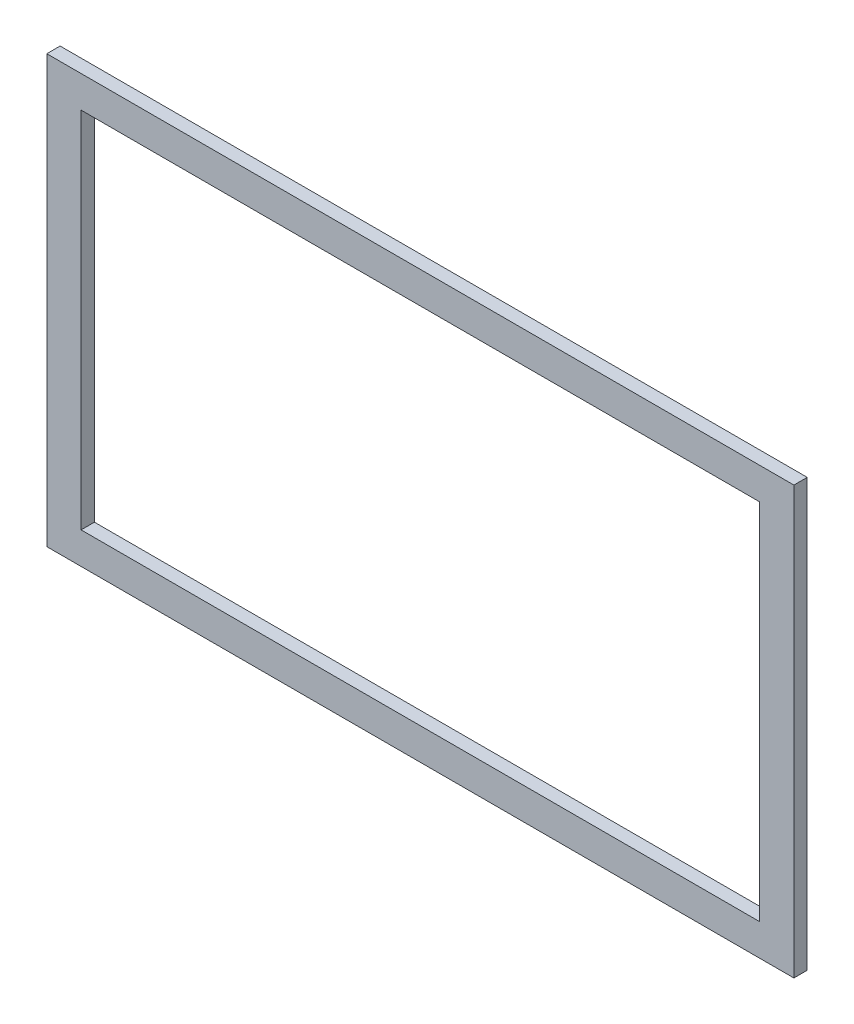
ISO-10303-21;
HEADER;
FILE_DESCRIPTION(('STEP AP214'),'2;1');
FILE_NAME('part.step','',(''),(''),'','','');
FILE_SCHEMA(('AUTOMOTIVE_DESIGN { 1 0 10303 214 1 1 1 1 }'));
ENDSEC;
DATA;
#1=APPLICATION_CONTEXT('core data for automotive mechanical design processes');
#2=APPLICATION_PROTOCOL_DEFINITION('international standard','automotive_design',2000,#1);
#3=PRODUCT_CONTEXT('',#1,'mechanical');
#4=PRODUCT('Part','Part','',(#3));
#5=PRODUCT_RELATED_PRODUCT_CATEGORY('part','',(#4));
#6=PRODUCT_DEFINITION_FORMATION('','',#4);
#7=PRODUCT_DEFINITION_CONTEXT('part definition',#1,'design');
#8=PRODUCT_DEFINITION('design','',#6,#7);
#9=PRODUCT_DEFINITION_SHAPE('','',#8);
#10=(LENGTH_UNIT() NAMED_UNIT(*) SI_UNIT(.MILLI.,.METRE.));
#11=(NAMED_UNIT(*) PLANE_ANGLE_UNIT() SI_UNIT($,.RADIAN.));
#12=(NAMED_UNIT(*) SI_UNIT($,.STERADIAN.) SOLID_ANGLE_UNIT());
#13=UNCERTAINTY_MEASURE_WITH_UNIT(LENGTH_MEASURE(1.E-05),#10,'distance_accuracy_value','');
#14=(GEOMETRIC_REPRESENTATION_CONTEXT(3) GLOBAL_UNCERTAINTY_ASSIGNED_CONTEXT((#13)) GLOBAL_UNIT_ASSIGNED_CONTEXT((#10,
#11,#12)) REPRESENTATION_CONTEXT('',''));
#15=CARTESIAN_POINT('',(0.,0.,0.));
#16=DIRECTION('',(0.,0.,1.));
#17=DIRECTION('',(1.,0.,0.));
#18=AXIS2_PLACEMENT_3D('',#15,#16,#17);
#19=CARTESIAN_POINT('',(-14.,-8.,0.5));
#20=DIRECTION('',(-1.,0.,0.));
#21=DIRECTION('',(0.,0.,1.));
#22=AXIS2_PLACEMENT_3D('',#19,#20,#21);
#23=PLANE('',#22);
#24=DIRECTION('',(0.,1.,0.));
#25=VECTOR('',#24,1.);
#26=CARTESIAN_POINT('',(-14.,-8.,0.));
#27=LINE('',#26,#25);
#28=CARTESIAN_POINT('',(-14.,-8.,0.));
#29=VERTEX_POINT('',#28);
#30=CARTESIAN_POINT('',(-14.,8.,0.));
#31=VERTEX_POINT('',#30);
#32=EDGE_CURVE('E130',#29,#31,#27,.T.);
#33=ORIENTED_EDGE('',*,*,#32,.F.);
#34=DIRECTION('',(0.,0.,-1.));
#35=VECTOR('',#34,1.);
#36=CARTESIAN_POINT('',(-14.,-8.,0.5));
#37=LINE('',#36,#35);
#38=CARTESIAN_POINT('',(-14.,-8.,0.5));
#39=VERTEX_POINT('',#38);
#40=EDGE_CURVE('E11',#39,#29,#37,.T.);
#41=ORIENTED_EDGE('',*,*,#40,.F.);
#42=DIRECTION('',(0.,1.,0.));
#43=VECTOR('',#42,1.);
#44=CARTESIAN_POINT('',(-14.,-8.,0.5));
#45=LINE('',#44,#43);
#46=CARTESIAN_POINT('',(-14.,8.,0.5));
#47=VERTEX_POINT('',#46);
#48=EDGE_CURVE('E134',#39,#47,#45,.T.);
#49=ORIENTED_EDGE('',*,*,#48,.T.);
#50=DIRECTION('',(0.,0.,-1.));
#51=VECTOR('',#50,1.);
#52=CARTESIAN_POINT('',(-14.,8.,0.5));
#53=LINE('',#52,#51);
#54=EDGE_CURVE('E35',#47,#31,#53,.T.);
#55=ORIENTED_EDGE('',*,*,#54,.T.);
#56=EDGE_LOOP('',(#33,#41,#49,#55));
#57=FACE_BOUND('',#56,.T.);
#58=ADVANCED_FACE('F32',(#57),#23,.T.);
#59=CARTESIAN_POINT('',(-14.,-8.,0.5));
#60=DIRECTION('',(0.,1.,0.));
#61=DIRECTION('',(0.,0.,1.));
#62=AXIS2_PLACEMENT_3D('',#59,#60,#61);
#63=PLANE('',#62);
#64=DIRECTION('',(1.,0.,0.));
#65=VECTOR('',#64,1.);
#66=CARTESIAN_POINT('',(-14.,-8.,0.));
#67=LINE('',#66,#65);
#68=CARTESIAN_POINT('',(14.,-8.,0.));
#69=VERTEX_POINT('',#68);
#70=EDGE_CURVE('E138',#29,#69,#67,.T.);
#71=ORIENTED_EDGE('',*,*,#70,.T.);
#72=DIRECTION('',(0.,0.,-1.));
#73=VECTOR('',#72,1.);
#74=CARTESIAN_POINT('',(14.,-8.,0.5));
#75=LINE('',#74,#73);
#76=CARTESIAN_POINT('',(14.,-8.,0.5));
#77=VERTEX_POINT('',#76);
#78=EDGE_CURVE('E40',#77,#69,#75,.T.);
#79=ORIENTED_EDGE('',*,*,#78,.F.);
#80=DIRECTION('',(1.,0.,0.));
#81=VECTOR('',#80,1.);
#82=CARTESIAN_POINT('',(-14.,-8.,0.5));
#83=LINE('',#82,#81);
#84=EDGE_CURVE('E143',#39,#77,#83,.T.);
#85=ORIENTED_EDGE('',*,*,#84,.F.);
#86=ORIENTED_EDGE('',*,*,#40,.T.);
#87=EDGE_LOOP('',(#71,#79,#85,#86));
#88=FACE_BOUND('',#87,.T.);
#89=ADVANCED_FACE('F168',(#88),#63,.F.);
#90=CARTESIAN_POINT('',(14.,-8.,0.5));
#91=DIRECTION('',(-1.,0.,0.));
#92=DIRECTION('',(0.,0.,1.));
#93=AXIS2_PLACEMENT_3D('',#90,#91,#92);
#94=PLANE('',#93);
#95=DIRECTION('',(0.,1.,0.));
#96=VECTOR('',#95,1.);
#97=CARTESIAN_POINT('',(14.,-8.,0.));
#98=LINE('',#97,#96);
#99=CARTESIAN_POINT('',(14.,8.,0.));
#100=VERTEX_POINT('',#99);
#101=EDGE_CURVE('E150',#69,#100,#98,.T.);
#102=ORIENTED_EDGE('',*,*,#101,.T.);
#103=DIRECTION('',(0.,0.,-1.));
#104=VECTOR('',#103,1.);
#105=CARTESIAN_POINT('',(14.,8.,0.5));
#106=LINE('',#105,#104);
#107=CARTESIAN_POINT('',(14.,8.,0.5));
#108=VERTEX_POINT('',#107);
#109=EDGE_CURVE('E155',#108,#100,#106,.T.);
#110=ORIENTED_EDGE('',*,*,#109,.F.);
#111=DIRECTION('',(0.,1.,0.));
#112=VECTOR('',#111,1.);
#113=CARTESIAN_POINT('',(14.,-8.,0.5));
#114=LINE('',#113,#112);
#115=EDGE_CURVE('E141',#77,#108,#114,.T.);
#116=ORIENTED_EDGE('',*,*,#115,.F.);
#117=ORIENTED_EDGE('',*,*,#78,.T.);
#118=EDGE_LOOP('',(#102,#110,#116,#117));
#119=FACE_BOUND('',#118,.T.);
#120=ADVANCED_FACE('F172',(#119),#94,.F.);
#121=CARTESIAN_POINT('',(-14.,8.,0.5));
#122=DIRECTION('',(0.,1.,0.));
#123=DIRECTION('',(0.,0.,1.));
#124=AXIS2_PLACEMENT_3D('',#121,#122,#123);
#125=PLANE('',#124);
#126=DIRECTION('',(1.,0.,0.));
#127=VECTOR('',#126,1.);
#128=CARTESIAN_POINT('',(-14.,8.,0.));
#129=LINE('',#128,#127);
#130=EDGE_CURVE('E147',#31,#100,#129,.T.);
#131=ORIENTED_EDGE('',*,*,#130,.F.);
#132=ORIENTED_EDGE('',*,*,#54,.F.);
#133=DIRECTION('',(1.,0.,0.));
#134=VECTOR('',#133,1.);
#135=CARTESIAN_POINT('',(-14.,8.,0.5));
#136=LINE('',#135,#134);
#137=EDGE_CURVE('E137',#47,#108,#136,.T.);
#138=ORIENTED_EDGE('',*,*,#137,.T.);
#139=ORIENTED_EDGE('',*,*,#109,.T.);
#140=EDGE_LOOP('',(#131,#132,#138,#139));
#141=FACE_BOUND('',#140,.T.);
#142=ADVANCED_FACE('F163',(#141),#125,.T.);
#143=CARTESIAN_POINT('',(0.,0.,0.5));
#144=DIRECTION('',(0.,0.,-1.));
#145=DIRECTION('',(-1.,0.,0.));
#146=AXIS2_PLACEMENT_3D('',#143,#144,#145);
#147=PLANE('',#146);
#148=DIRECTION('',(-1.,0.,0.));
#149=VECTOR('',#148,1.);
#150=CARTESIAN_POINT('',(-12.7133034614236,6.81232568990263,0.5));
#151=LINE('',#150,#149);
#152=CARTESIAN_POINT('',(12.7133034614236,6.81232568990263,0.5));
#153=VERTEX_POINT('',#152);
#154=CARTESIAN_POINT('',(-12.7133034614236,6.81232568990263,0.5));
#155=VERTEX_POINT('',#154);
#156=EDGE_CURVE('E124',#153,#155,#151,.T.);
#157=ORIENTED_EDGE('',*,*,#156,.F.);
#158=DIRECTION('',(0.,1.,0.));
#159=VECTOR('',#158,1.);
#160=CARTESIAN_POINT('',(12.7133034614236,-6.81232568990263,0.5));
#161=LINE('',#160,#159);
#162=CARTESIAN_POINT('',(12.7133034614236,-6.81232568990263,0.5));
#163=VERTEX_POINT('',#162);
#164=EDGE_CURVE('E48',#163,#153,#161,.T.);
#165=ORIENTED_EDGE('',*,*,#164,.F.);
#166=DIRECTION('',(1.,0.,0.));
#167=VECTOR('',#166,1.);
#168=CARTESIAN_POINT('',(-12.7133034614236,-6.81232568990263,0.5));
#169=LINE('',#168,#167);
#170=CARTESIAN_POINT('',(-12.7133034614236,-6.81232568990263,0.5));
#171=VERTEX_POINT('',#170);
#172=EDGE_CURVE('E115',#171,#163,#169,.T.);
#173=ORIENTED_EDGE('',*,*,#172,.F.);
#174=DIRECTION('',(0.,-1.,0.));
#175=VECTOR('',#174,1.);
#176=CARTESIAN_POINT('',(-12.7133034614236,-6.81232568990263,0.5));
#177=LINE('',#176,#175);
#178=EDGE_CURVE('E118',#155,#171,#177,.T.);
#179=ORIENTED_EDGE('',*,*,#178,.F.);
#180=EDGE_LOOP('',(#157,#165,#173,#179));
#181=FACE_BOUND('',#180,.T.);
#182=ORIENTED_EDGE('',*,*,#48,.F.);
#183=ORIENTED_EDGE('',*,*,#84,.T.);
#184=ORIENTED_EDGE('',*,*,#115,.T.);
#185=ORIENTED_EDGE('',*,*,#137,.F.);
#186=EDGE_LOOP('',(#182,#183,#184,#185));
#187=FACE_BOUND('',#186,.T.);
#188=ADVANCED_FACE('F174',(#181,#187),#147,.F.);
#189=CARTESIAN_POINT('',(0.,0.,0.));
#190=DIRECTION('',(0.,0.,-1.));
#191=DIRECTION('',(-1.,0.,0.));
#192=AXIS2_PLACEMENT_3D('',#189,#190,#191);
#193=PLANE('',#192);
#194=DIRECTION('',(0.,1.,0.));
#195=VECTOR('',#194,1.);
#196=CARTESIAN_POINT('',(12.7133034614236,-6.81232568990263,0.));
#197=LINE('',#196,#195);
#198=CARTESIAN_POINT('',(12.7133034614236,-6.81232568990263,0.));
#199=VERTEX_POINT('',#198);
#200=CARTESIAN_POINT('',(12.7133034614236,6.81232568990263,0.));
#201=VERTEX_POINT('',#200);
#202=EDGE_CURVE('E99',#199,#201,#197,.T.);
#203=ORIENTED_EDGE('',*,*,#202,.T.);
#204=DIRECTION('',(-1.,0.,0.));
#205=VECTOR('',#204,1.);
#206=CARTESIAN_POINT('',(-12.7133034614236,6.81232568990263,0.));
#207=LINE('',#206,#205);
#208=CARTESIAN_POINT('',(-12.7133034614236,6.81232568990263,0.));
#209=VERTEX_POINT('',#208);
#210=EDGE_CURVE('E108',#201,#209,#207,.T.);
#211=ORIENTED_EDGE('',*,*,#210,.T.);
#212=DIRECTION('',(0.,-1.,0.));
#213=VECTOR('',#212,1.);
#214=CARTESIAN_POINT('',(-12.7133034614236,-6.81232568990263,0.));
#215=LINE('',#214,#213);
#216=CARTESIAN_POINT('',(-12.7133034614236,-6.81232568990263,0.));
#217=VERTEX_POINT('',#216);
#218=EDGE_CURVE('E56',#209,#217,#215,.T.);
#219=ORIENTED_EDGE('',*,*,#218,.T.);
#220=DIRECTION('',(1.,0.,0.));
#221=VECTOR('',#220,1.);
#222=CARTESIAN_POINT('',(-12.7133034614236,-6.81232568990263,0.));
#223=LINE('',#222,#221);
#224=EDGE_CURVE('E105',#217,#199,#223,.T.);
#225=ORIENTED_EDGE('',*,*,#224,.T.);
#226=EDGE_LOOP('',(#203,#211,#219,#225));
#227=FACE_BOUND('',#226,.T.);
#228=ORIENTED_EDGE('',*,*,#32,.T.);
#229=ORIENTED_EDGE('',*,*,#130,.T.);
#230=ORIENTED_EDGE('',*,*,#101,.F.);
#231=ORIENTED_EDGE('',*,*,#70,.F.);
#232=EDGE_LOOP('',(#228,#229,#230,#231));
#233=FACE_BOUND('',#232,.T.);
#234=ADVANCED_FACE('F112',(#227,#233),#193,.T.);
#235=CARTESIAN_POINT('',(12.7133034614236,-6.81232568990263,0.));
#236=DIRECTION('',(1.,0.,0.));
#237=DIRECTION('',(0.,0.,-1.));
#238=AXIS2_PLACEMENT_3D('',#235,#236,#237);
#239=PLANE('',#238);
#240=ORIENTED_EDGE('',*,*,#164,.T.);
#241=DIRECTION('',(0.,0.,1.));
#242=VECTOR('',#241,1.);
#243=CARTESIAN_POINT('',(12.7133034614236,6.81232568990263,0.));
#244=LINE('',#243,#242);
#245=EDGE_CURVE('E95',#201,#153,#244,.T.);
#246=ORIENTED_EDGE('',*,*,#245,.F.);
#247=ORIENTED_EDGE('',*,*,#202,.F.);
#248=DIRECTION('',(0.,0.,1.));
#249=VECTOR('',#248,1.);
#250=CARTESIAN_POINT('',(12.7133034614236,-6.81232568990263,0.));
#251=LINE('',#250,#249);
#252=EDGE_CURVE('E128',#199,#163,#251,.T.);
#253=ORIENTED_EDGE('',*,*,#252,.T.);
#254=EDGE_LOOP('',(#240,#246,#247,#253));
#255=FACE_BOUND('',#254,.T.);
#256=ADVANCED_FACE('F97',(#255),#239,.F.);
#257=CARTESIAN_POINT('',(-12.7133034614236,-6.81232568990263,0.));
#258=DIRECTION('',(0.,-1.,0.));
#259=DIRECTION('',(0.,0.,-1.));
#260=AXIS2_PLACEMENT_3D('',#257,#258,#259);
#261=PLANE('',#260);
#262=ORIENTED_EDGE('',*,*,#172,.T.);
#263=ORIENTED_EDGE('',*,*,#252,.F.);
#264=ORIENTED_EDGE('',*,*,#224,.F.);
#265=DIRECTION('',(0.,0.,1.));
#266=VECTOR('',#265,1.);
#267=CARTESIAN_POINT('',(-12.7133034614236,-6.81232568990263,0.));
#268=LINE('',#267,#266);
#269=EDGE_CURVE('E131',#217,#171,#268,.T.);
#270=ORIENTED_EDGE('',*,*,#269,.T.);
#271=EDGE_LOOP('',(#262,#263,#264,#270));
#272=FACE_BOUND('',#271,.T.);
#273=ADVANCED_FACE('F218',(#272),#261,.F.);
#274=CARTESIAN_POINT('',(-12.7133034614236,-6.81232568990263,0.));
#275=DIRECTION('',(-1.,0.,0.));
#276=DIRECTION('',(0.,0.,1.));
#277=AXIS2_PLACEMENT_3D('',#274,#275,#276);
#278=PLANE('',#277);
#279=ORIENTED_EDGE('',*,*,#178,.T.);
#280=ORIENTED_EDGE('',*,*,#269,.F.);
#281=ORIENTED_EDGE('',*,*,#218,.F.);
#282=DIRECTION('',(0.,0.,1.));
#283=VECTOR('',#282,1.);
#284=CARTESIAN_POINT('',(-12.7133034614236,6.81232568990263,0.));
#285=LINE('',#284,#283);
#286=EDGE_CURVE('E104',#209,#155,#285,.T.);
#287=ORIENTED_EDGE('',*,*,#286,.T.);
#288=EDGE_LOOP('',(#279,#280,#281,#287));
#289=FACE_BOUND('',#288,.T.);
#290=ADVANCED_FACE('F226',(#289),#278,.F.);
#291=CARTESIAN_POINT('',(-12.7133034614236,6.81232568990263,0.));
#292=DIRECTION('',(0.,1.,0.));
#293=DIRECTION('',(0.,0.,1.));
#294=AXIS2_PLACEMENT_3D('',#291,#292,#293);
#295=PLANE('',#294);
#296=ORIENTED_EDGE('',*,*,#156,.T.);
#297=ORIENTED_EDGE('',*,*,#286,.F.);
#298=ORIENTED_EDGE('',*,*,#210,.F.);
#299=ORIENTED_EDGE('',*,*,#245,.T.);
#300=EDGE_LOOP('',(#296,#297,#298,#299));
#301=FACE_BOUND('',#300,.T.);
#302=ADVANCED_FACE('F109',(#301),#295,.F.);
#303=CLOSED_SHELL('',(#58,#89,#120,#142,#188,#234,#256,#273,#290,#302));
#304=MANIFOLD_SOLID_BREP('B2',#303);
#305=ADVANCED_BREP_SHAPE_REPRESENTATION('',(#18,#304),#14);
#306=SHAPE_DEFINITION_REPRESENTATION(#9,#305);
ENDSEC;
END-ISO-10303-21;
